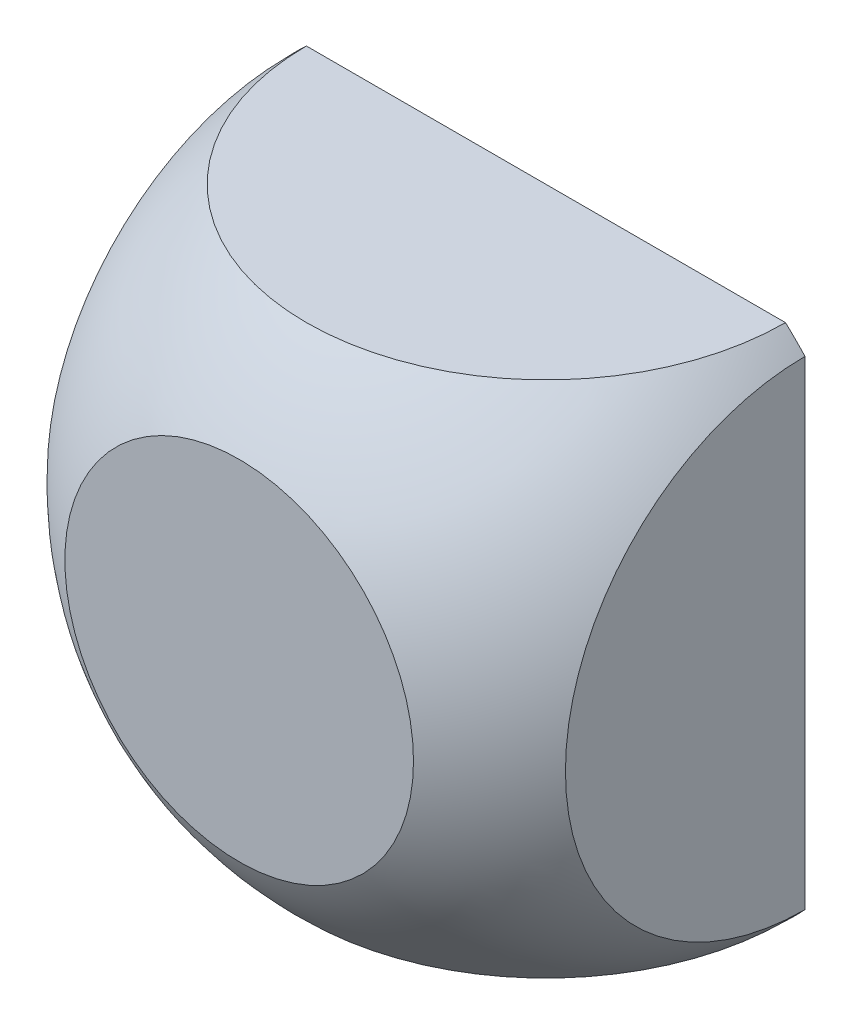
ISO-10303-21;
HEADER;
FILE_DESCRIPTION(('STEP AP214'),'2;1');
FILE_NAME('part.step','',(''),(''),'','','');
FILE_SCHEMA(('AUTOMOTIVE_DESIGN { 1 0 10303 214 1 1 1 1 }'));
ENDSEC;
DATA;
#1=APPLICATION_CONTEXT('core data for automotive mechanical design processes');
#2=APPLICATION_PROTOCOL_DEFINITION('international standard','automotive_design',2000,#1);
#3=PRODUCT_CONTEXT('',#1,'mechanical');
#4=PRODUCT('Part','Part','',(#3));
#5=PRODUCT_RELATED_PRODUCT_CATEGORY('part','',(#4));
#6=PRODUCT_DEFINITION_FORMATION('','',#4);
#7=PRODUCT_DEFINITION_CONTEXT('part definition',#1,'design');
#8=PRODUCT_DEFINITION('design','',#6,#7);
#9=PRODUCT_DEFINITION_SHAPE('','',#8);
#10=(LENGTH_UNIT() NAMED_UNIT(*) SI_UNIT(.MILLI.,.METRE.));
#11=(NAMED_UNIT(*) PLANE_ANGLE_UNIT() SI_UNIT($,.RADIAN.));
#12=(NAMED_UNIT(*) SI_UNIT($,.STERADIAN.) SOLID_ANGLE_UNIT());
#13=UNCERTAINTY_MEASURE_WITH_UNIT(LENGTH_MEASURE(1.E-05),#10,'distance_accuracy_value','');
#14=(GEOMETRIC_REPRESENTATION_CONTEXT(3) GLOBAL_UNCERTAINTY_ASSIGNED_CONTEXT((#13)) GLOBAL_UNIT_ASSIGNED_CONTEXT((#10,
#11,#12)) REPRESENTATION_CONTEXT('',''));
#15=CARTESIAN_POINT('',(0.,0.,0.));
#16=DIRECTION('',(0.,0.,1.));
#17=DIRECTION('',(1.,0.,0.));
#18=AXIS2_PLACEMENT_3D('',#15,#16,#17);
#19=CARTESIAN_POINT('',(38.,38.,45.));
#20=DIRECTION('',(-1.,0.,0.));
#21=DIRECTION('',(0.,-1.,0.));
#22=AXIS2_PLACEMENT_3D('',#19,#20,#21);
#23=PLANE('',#22);
#24=CARTESIAN_POINT('',(38.,0.,0.));
#25=DIRECTION('',(-1.,0.,0.));
#26=DIRECTION('',(0.,-1.,0.));
#27=AXIS2_PLACEMENT_3D('',#24,#25,#26);
#28=CIRCLE('',#27,35.1409314745184);
#29=CARTESIAN_POINT('',(38.,-35.1409314745183,0.));
#30=VERTEX_POINT('',#29);
#31=CARTESIAN_POINT('',(38.,35.1409314745184,0.));
#32=VERTEX_POINT('',#31);
#33=EDGE_CURVE('E71',#30,#32,#28,.T.);
#34=ORIENTED_EDGE('',*,*,#33,.F.);
#35=DIRECTION('',(0.,1.,0.));
#36=VECTOR('',#35,1.);
#37=CARTESIAN_POINT('',(38.,38.,0.));
#38=LINE('',#37,#36);
#39=EDGE_CURVE('E81',#30,#32,#38,.T.);
#40=ORIENTED_EDGE('',*,*,#39,.T.);
#41=EDGE_LOOP('',(#34,#40));
#42=FACE_BOUND('',#41,.T.);
#43=ADVANCED_FACE('F33',(#42),#23,.F.);
#44=CARTESIAN_POINT('',(-38.,38.,45.));
#45=DIRECTION('',(0.,-1.,0.));
#46=DIRECTION('',(0.,0.,-1.));
#47=AXIS2_PLACEMENT_3D('',#44,#45,#46);
#48=PLANE('',#47);
#49=CARTESIAN_POINT('',(0.,38.,0.));
#50=DIRECTION('',(0.,-1.,0.));
#51=DIRECTION('',(0.,0.,-1.));
#52=AXIS2_PLACEMENT_3D('',#49,#50,#51);
#53=CIRCLE('',#52,35.1409314745184);
#54=CARTESIAN_POINT('',(35.1409314745184,38.,0.));
#55=VERTEX_POINT('',#54);
#56=CARTESIAN_POINT('',(-35.1409314745184,38.,0.));
#57=VERTEX_POINT('',#56);
#58=EDGE_CURVE('E54',#55,#57,#53,.T.);
#59=ORIENTED_EDGE('',*,*,#58,.F.);
#60=DIRECTION('',(-1.,0.,0.));
#61=VECTOR('',#60,1.);
#62=CARTESIAN_POINT('',(-38.,38.,0.));
#63=LINE('',#62,#61);
#64=EDGE_CURVE('E86',#55,#57,#63,.T.);
#65=ORIENTED_EDGE('',*,*,#64,.T.);
#66=EDGE_LOOP('',(#59,#65));
#67=FACE_BOUND('',#66,.T.);
#68=ADVANCED_FACE('F107',(#67),#48,.F.);
#69=CARTESIAN_POINT('',(-38.,38.,45.));
#70=DIRECTION('',(1.,0.,0.));
#71=DIRECTION('',(0.,1.,0.));
#72=AXIS2_PLACEMENT_3D('',#69,#70,#71);
#73=PLANE('',#72);
#74=CARTESIAN_POINT('',(-38.,0.,0.));
#75=DIRECTION('',(1.,0.,0.));
#76=DIRECTION('',(0.,1.,0.));
#77=AXIS2_PLACEMENT_3D('',#74,#75,#76);
#78=CIRCLE('',#77,35.1409314745184);
#79=CARTESIAN_POINT('',(-38.,35.1409314745184,0.));
#80=VERTEX_POINT('',#79);
#81=CARTESIAN_POINT('',(-38.,-35.1409314745184,0.));
#82=VERTEX_POINT('',#81);
#83=EDGE_CURVE('E82',#80,#82,#78,.T.);
#84=ORIENTED_EDGE('',*,*,#83,.F.);
#85=DIRECTION('',(0.,-1.,0.));
#86=VECTOR('',#85,1.);
#87=CARTESIAN_POINT('',(-38.,38.,0.));
#88=LINE('',#87,#86);
#89=EDGE_CURVE('E90',#80,#82,#88,.T.);
#90=ORIENTED_EDGE('',*,*,#89,.T.);
#91=EDGE_LOOP('',(#84,#90));
#92=FACE_BOUND('',#91,.T.);
#93=ADVANCED_FACE('F103',(#92),#73,.F.);
#94=CARTESIAN_POINT('',(-38.,-38.,45.));
#95=DIRECTION('',(0.,1.,0.));
#96=DIRECTION('',(0.,0.,1.));
#97=AXIS2_PLACEMENT_3D('',#94,#95,#96);
#98=PLANE('',#97);
#99=CARTESIAN_POINT('',(0.,-38.,0.));
#100=DIRECTION('',(0.,1.,0.));
#101=DIRECTION('',(0.,0.,1.));
#102=AXIS2_PLACEMENT_3D('',#99,#100,#101);
#103=CIRCLE('',#102,35.1409314745183);
#104=CARTESIAN_POINT('',(-35.1409314745183,-38.,0.));
#105=VERTEX_POINT('',#104);
#106=CARTESIAN_POINT('',(35.1409314745183,-38.,0.));
#107=VERTEX_POINT('',#106);
#108=EDGE_CURVE('E48',#105,#107,#103,.T.);
#109=ORIENTED_EDGE('',*,*,#108,.F.);
#110=DIRECTION('',(1.,0.,0.));
#111=VECTOR('',#110,1.);
#112=CARTESIAN_POINT('',(-38.,-38.,0.));
#113=LINE('',#112,#111);
#114=EDGE_CURVE('E78',#105,#107,#113,.T.);
#115=ORIENTED_EDGE('',*,*,#114,.T.);
#116=EDGE_LOOP('',(#109,#115));
#117=FACE_BOUND('',#116,.T.);
#118=ADVANCED_FACE('F98',(#117),#98,.F.);
#119=CARTESIAN_POINT('',(0.,0.,0.));
#120=DIRECTION('',(0.,0.,1.));
#121=DIRECTION('',(1.,0.,0.));
#122=AXIS2_PLACEMENT_3D('',#119,#120,#121);
#123=PLANE('',#122);
#124=CARTESIAN_POINT('',(0.,0.,0.));
#125=DIRECTION('',(0.,0.,1.));
#126=DIRECTION('',(1.,0.,0.));
#127=AXIS2_PLACEMENT_3D('',#124,#125,#126);
#128=CIRCLE('',#127,51.7579468767531);
#129=EDGE_CURVE('E11',#32,#55,#128,.T.);
#130=ORIENTED_EDGE('',*,*,#129,.F.);
#131=ORIENTED_EDGE('',*,*,#39,.F.);
#132=EDGE_CURVE('E36',#107,#30,#128,.T.);
#133=ORIENTED_EDGE('',*,*,#132,.F.);
#134=ORIENTED_EDGE('',*,*,#114,.F.);
#135=EDGE_CURVE('E77',#82,#105,#128,.T.);
#136=ORIENTED_EDGE('',*,*,#135,.F.);
#137=ORIENTED_EDGE('',*,*,#89,.F.);
#138=EDGE_CURVE('E41',#57,#80,#128,.T.);
#139=ORIENTED_EDGE('',*,*,#138,.F.);
#140=ORIENTED_EDGE('',*,*,#64,.F.);
#141=EDGE_LOOP('',(#130,#131,#133,#134,#136,#137,#139,#140));
#142=FACE_BOUND('',#141,.T.);
#143=ADVANCED_FACE('F84',(#142),#123,.F.);
#144=CARTESIAN_POINT('',(0.,0.,0.));
#145=DIRECTION('',(0.,0.,1.));
#146=DIRECTION('',(0.,-1.,0.));
#147=AXIS2_PLACEMENT_3D('',#144,#145,#146);
#148=SPHERICAL_SURFACE('',#147,51.7579468767531);
#149=CARTESIAN_POINT('',(0.,0.,45.));
#150=DIRECTION('',(0.,0.,1.));
#151=DIRECTION('',(1.,0.,0.));
#152=AXIS2_PLACEMENT_3D('',#149,#150,#151);
#153=CIRCLE('',#152,25.5711764472578);
#154=CARTESIAN_POINT('',(25.5711764472578,0.,45.));
#155=VERTEX_POINT('',#154);
#156=EDGE_CURVE('E87',#155,#155,#153,.T.);
#157=ORIENTED_EDGE('',*,*,#156,.F.);
#158=EDGE_LOOP('',(#157));
#159=FACE_BOUND('',#158,.T.);
#160=ORIENTED_EDGE('',*,*,#138,.T.);
#161=ORIENTED_EDGE('',*,*,#83,.T.);
#162=ORIENTED_EDGE('',*,*,#135,.T.);
#163=ORIENTED_EDGE('',*,*,#108,.T.);
#164=ORIENTED_EDGE('',*,*,#132,.T.);
#165=ORIENTED_EDGE('',*,*,#33,.T.);
#166=ORIENTED_EDGE('',*,*,#129,.T.);
#167=ORIENTED_EDGE('',*,*,#58,.T.);
#168=EDGE_LOOP('',(#160,#161,#162,#163,#164,#165,#166,#167));
#169=FACE_BOUND('',#168,.T.);
#170=ADVANCED_FACE('F70',(#159,#169),#148,.T.);
#171=CARTESIAN_POINT('',(0.,0.,45.));
#172=DIRECTION('',(0.,0.,1.));
#173=DIRECTION('',(1.,0.,0.));
#174=AXIS2_PLACEMENT_3D('',#171,#172,#173);
#175=PLANE('',#174);
#176=ORIENTED_EDGE('',*,*,#156,.T.);
#177=EDGE_LOOP('',(#176));
#178=FACE_BOUND('',#177,.T.);
#179=ADVANCED_FACE('F119',(#178),#175,.T.);
#180=CLOSED_SHELL('',(#43,#68,#93,#118,#143,#170,#179));
#181=MANIFOLD_SOLID_BREP('B2',#180);
#182=ADVANCED_BREP_SHAPE_REPRESENTATION('',(#18,#181),#14);
#183=SHAPE_DEFINITION_REPRESENTATION(#9,#182);
ENDSEC;
END-ISO-10303-21;
